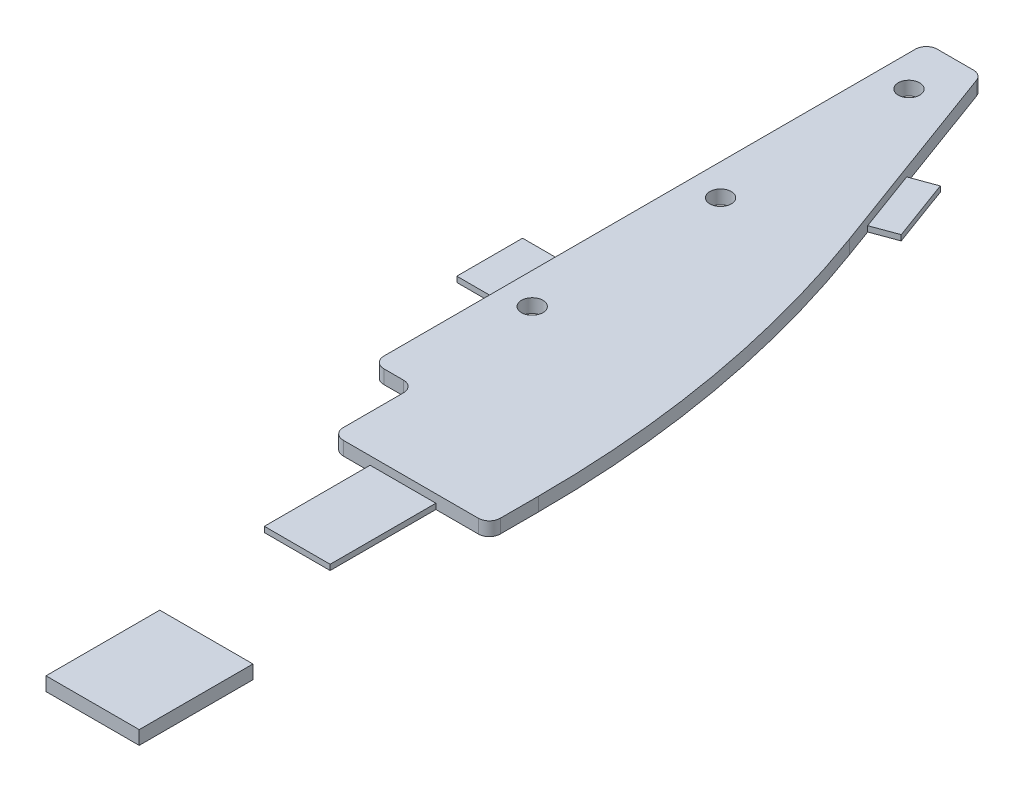
ISO-10303-21;
HEADER;
FILE_DESCRIPTION(('STEP AP214'),'2;1');
FILE_NAME('part.step','',(''),(''),'','','');
FILE_SCHEMA(('AUTOMOTIVE_DESIGN { 1 0 10303 214 1 1 1 1 }'));
ENDSEC;
DATA;
#1=APPLICATION_CONTEXT('core data for automotive mechanical design processes');
#2=APPLICATION_PROTOCOL_DEFINITION('international standard','automotive_design',2000,#1);
#3=PRODUCT_CONTEXT('',#1,'mechanical');
#4=PRODUCT('Part','Part','',(#3));
#5=PRODUCT_RELATED_PRODUCT_CATEGORY('part','',(#4));
#6=PRODUCT_DEFINITION_FORMATION('','',#4);
#7=PRODUCT_DEFINITION_CONTEXT('part definition',#1,'design');
#8=PRODUCT_DEFINITION('design','',#6,#7);
#9=PRODUCT_DEFINITION_SHAPE('','',#8);
#10=(LENGTH_UNIT() NAMED_UNIT(*) SI_UNIT(.MILLI.,.METRE.));
#11=(NAMED_UNIT(*) PLANE_ANGLE_UNIT() SI_UNIT($,.RADIAN.));
#12=(NAMED_UNIT(*) SI_UNIT($,.STERADIAN.) SOLID_ANGLE_UNIT());
#13=UNCERTAINTY_MEASURE_WITH_UNIT(LENGTH_MEASURE(1.E-05),#10,'distance_accuracy_value','');
#14=(GEOMETRIC_REPRESENTATION_CONTEXT(3) GLOBAL_UNCERTAINTY_ASSIGNED_CONTEXT((#13)) GLOBAL_UNIT_ASSIGNED_CONTEXT((#10,
#11,#12)) REPRESENTATION_CONTEXT('',''));
#15=CARTESIAN_POINT('',(0.,0.,0.));
#16=DIRECTION('',(0.,0.,1.));
#17=DIRECTION('',(1.,0.,0.));
#18=AXIS2_PLACEMENT_3D('',#15,#16,#17);
#19=CARTESIAN_POINT('',(-166.099808789646,-37.2537864150574,55.3629159312266));
#20=DIRECTION('',(1.,0.,0.));
#21=DIRECTION('',(0.,0.,-1.));
#22=AXIS2_PLACEMENT_3D('',#19,#20,#21);
#23=PLANE('',#22);
#24=DIRECTION('',(0.,0.,1.));
#25=VECTOR('',#24,1.);
#26=CARTESIAN_POINT('',(-166.099808789646,-3.175,55.3629159312266));
#27=LINE('',#26,#25);
#28=CARTESIAN_POINT('',(-166.099808789646,-3.175,55.3629159312266));
#29=VERTEX_POINT('',#28);
#30=CARTESIAN_POINT('',(-166.099808789646,-3.175,81.7207432362466));
#31=VERTEX_POINT('',#30);
#32=EDGE_CURVE('E60',#29,#31,#27,.T.);
#33=ORIENTED_EDGE('',*,*,#32,.F.);
#34=DIRECTION('',(0.,1.,0.));
#35=VECTOR('',#34,1.);
#36=CARTESIAN_POINT('',(-166.099808789646,-37.2537864150574,55.3629159312266));
#37=LINE('',#36,#35);
#38=CARTESIAN_POINT('',(-166.099808789646,0.,55.3629159312266));
#39=VERTEX_POINT('',#38);
#40=EDGE_CURVE('E88',#29,#39,#37,.T.);
#41=ORIENTED_EDGE('',*,*,#40,.T.);
#42=DIRECTION('',(0.,0.,-1.));
#43=VECTOR('',#42,1.);
#44=CARTESIAN_POINT('',(-166.099808789646,0.,55.3629159312266));
#45=LINE('',#44,#43);
#46=CARTESIAN_POINT('',(-166.099808789646,0.,81.7207432362466));
#47=VERTEX_POINT('',#46);
#48=EDGE_CURVE('E92',#47,#39,#45,.T.);
#49=ORIENTED_EDGE('',*,*,#48,.F.);
#50=DIRECTION('',(0.,1.,0.));
#51=VECTOR('',#50,1.);
#52=CARTESIAN_POINT('',(-166.099808789646,-37.2537864150574,81.7207432362466));
#53=LINE('',#52,#51);
#54=EDGE_CURVE('E115',#31,#47,#53,.T.);
#55=ORIENTED_EDGE('',*,*,#54,.F.);
#56=EDGE_LOOP('',(#33,#41,#49,#55));
#57=FACE_BOUND('',#56,.T.);
#58=ADVANCED_FACE('F52',(#57),#23,.T.);
#59=CARTESIAN_POINT('',(-166.099808789646,-37.2537864150574,81.7207432362466));
#60=DIRECTION('',(0.,0.,1.));
#61=DIRECTION('',(1.,0.,0.));
#62=AXIS2_PLACEMENT_3D('',#59,#60,#61);
#63=PLANE('',#62);
#64=DIRECTION('',(-1.,0.,0.));
#65=VECTOR('',#64,1.);
#66=CARTESIAN_POINT('',(-166.099808789646,-3.175,81.7207432362466));
#67=LINE('',#66,#65);
#68=CARTESIAN_POINT('',(-187.701397233134,-3.175,81.7207432362466));
#69=VERTEX_POINT('',#68);
#70=EDGE_CURVE('E66',#31,#69,#67,.T.);
#71=ORIENTED_EDGE('',*,*,#70,.F.);
#72=ORIENTED_EDGE('',*,*,#54,.T.);
#73=DIRECTION('',(1.,0.,0.));
#74=VECTOR('',#73,1.);
#75=CARTESIAN_POINT('',(-166.099808789646,0.,81.7207432362466));
#76=LINE('',#75,#74);
#77=CARTESIAN_POINT('',(-187.701397233134,0.,81.7207432362466));
#78=VERTEX_POINT('',#77);
#79=EDGE_CURVE('E97',#78,#47,#76,.T.);
#80=ORIENTED_EDGE('',*,*,#79,.F.);
#81=DIRECTION('',(0.,1.,0.));
#82=VECTOR('',#81,1.);
#83=CARTESIAN_POINT('',(-187.701397233134,-37.2537864150574,81.7207432362466));
#84=LINE('',#83,#82);
#85=EDGE_CURVE('E118',#69,#78,#84,.T.);
#86=ORIENTED_EDGE('',*,*,#85,.F.);
#87=EDGE_LOOP('',(#71,#72,#80,#86));
#88=FACE_BOUND('',#87,.T.);
#89=ADVANCED_FACE('F124',(#88),#63,.T.);
#90=CARTESIAN_POINT('',(-187.701397233134,-37.2537864150574,55.3629159312266));
#91=DIRECTION('',(-1.,0.,0.));
#92=DIRECTION('',(0.,0.,1.));
#93=AXIS2_PLACEMENT_3D('',#90,#91,#92);
#94=PLANE('',#93);
#95=DIRECTION('',(0.,0.,-1.));
#96=VECTOR('',#95,1.);
#97=CARTESIAN_POINT('',(-187.701397233134,-3.175,55.3629159312266));
#98=LINE('',#97,#96);
#99=CARTESIAN_POINT('',(-187.701397233134,-3.175,55.3629159312266));
#100=VERTEX_POINT('',#99);
#101=EDGE_CURVE('E117',#69,#100,#98,.T.);
#102=ORIENTED_EDGE('',*,*,#101,.F.);
#103=ORIENTED_EDGE('',*,*,#85,.T.);
#104=DIRECTION('',(0.,0.,1.));
#105=VECTOR('',#104,1.);
#106=CARTESIAN_POINT('',(-187.701397233134,0.,55.3629159312266));
#107=LINE('',#106,#105);
#108=CARTESIAN_POINT('',(-187.701397233134,0.,55.3629159312266));
#109=VERTEX_POINT('',#108);
#110=EDGE_CURVE('E105',#109,#78,#107,.T.);
#111=ORIENTED_EDGE('',*,*,#110,.F.);
#112=DIRECTION('',(0.,1.,0.));
#113=VECTOR('',#112,1.);
#114=CARTESIAN_POINT('',(-187.701397233134,-37.2537864150574,55.3629159312266));
#115=LINE('',#114,#113);
#116=EDGE_CURVE('E96',#100,#109,#115,.T.);
#117=ORIENTED_EDGE('',*,*,#116,.F.);
#118=EDGE_LOOP('',(#102,#103,#111,#117));
#119=FACE_BOUND('',#118,.T.);
#120=ADVANCED_FACE('F122',(#119),#94,.T.);
#121=CARTESIAN_POINT('',(-166.099808789646,-37.2537864150574,55.3629159312266));
#122=DIRECTION('',(0.,0.,-1.));
#123=DIRECTION('',(-1.,0.,0.));
#124=AXIS2_PLACEMENT_3D('',#121,#122,#123);
#125=PLANE('',#124);
#126=DIRECTION('',(1.,0.,0.));
#127=VECTOR('',#126,1.);
#128=CARTESIAN_POINT('',(-166.099808789646,-3.175,55.3629159312266));
#129=LINE('',#128,#127);
#130=EDGE_CURVE('E12',#100,#29,#129,.T.);
#131=ORIENTED_EDGE('',*,*,#130,.F.);
#132=ORIENTED_EDGE('',*,*,#116,.T.);
#133=DIRECTION('',(-1.,0.,0.));
#134=VECTOR('',#133,1.);
#135=CARTESIAN_POINT('',(-166.099808789646,0.,55.3629159312266));
#136=LINE('',#135,#134);
#137=EDGE_CURVE('E99',#39,#109,#136,.T.);
#138=ORIENTED_EDGE('',*,*,#137,.F.);
#139=ORIENTED_EDGE('',*,*,#40,.F.);
#140=EDGE_LOOP('',(#131,#132,#138,#139));
#141=FACE_BOUND('',#140,.T.);
#142=ADVANCED_FACE('F100',(#141),#125,.T.);
#143=CARTESIAN_POINT('',(0.,0.,0.));
#144=DIRECTION('',(0.,-1.,0.));
#145=DIRECTION('',(0.,0.,-1.));
#146=AXIS2_PLACEMENT_3D('',#143,#144,#145);
#147=PLANE('',#146);
#148=ORIENTED_EDGE('',*,*,#48,.T.);
#149=ORIENTED_EDGE('',*,*,#137,.T.);
#150=ORIENTED_EDGE('',*,*,#110,.T.);
#151=ORIENTED_EDGE('',*,*,#79,.T.);
#152=EDGE_LOOP('',(#148,#149,#150,#151));
#153=FACE_BOUND('',#152,.T.);
#154=ADVANCED_FACE('F107',(#153),#147,.F.);
#155=CARTESIAN_POINT('',(-420.6875,-3.175,-11.43));
#156=DIRECTION('',(0.,1.,0.));
#157=DIRECTION('',(0.,0.,1.));
#158=AXIS2_PLACEMENT_3D('',#155,#156,#157);
#159=PLANE('',#158);
#160=ORIENTED_EDGE('',*,*,#32,.T.);
#161=ORIENTED_EDGE('',*,*,#70,.T.);
#162=ORIENTED_EDGE('',*,*,#101,.T.);
#163=ORIENTED_EDGE('',*,*,#130,.T.);
#164=EDGE_LOOP('',(#160,#161,#162,#163));
#165=FACE_BOUND('',#164,.T.);
#166=ADVANCED_FACE('F126',(#165),#159,.F.);
#167=CLOSED_SHELL('',(#58,#89,#120,#142,#154,#166));
#168=MANIFOLD_SOLID_BREP('B2',#167);
#169=CARTESIAN_POINT('',(-166.6875,-3.175,0.));
#170=DIRECTION('',(1.,0.,0.));
#171=DIRECTION('',(0.,0.,-1.));
#172=AXIS2_PLACEMENT_3D('',#169,#170,#171);
#173=PLANE('',#172);
#174=DIRECTION('',(0.,0.,-1.));
#175=VECTOR('',#174,1.);
#176=CARTESIAN_POINT('',(-166.6875,0.,0.));
#177=LINE('',#176,#175);
#178=CARTESIAN_POINT('',(-166.6875,0.,-2.53999999999999));
#179=VERTEX_POINT('',#178);
#180=CARTESIAN_POINT('',(-166.6875,0.,-11.43));
#181=VERTEX_POINT('',#180);
#182=EDGE_CURVE('E447',#179,#181,#177,.T.);
#183=ORIENTED_EDGE('',*,*,#182,.F.);
#184=DIRECTION('',(0.,1.,0.));
#185=VECTOR('',#184,1.);
#186=CARTESIAN_POINT('',(-166.6875,-3.175,-2.53999999999999));
#187=LINE('',#186,#185);
#188=CARTESIAN_POINT('',(-166.6875,-3.175,-2.53999999999999));
#189=VERTEX_POINT('',#188);
#190=EDGE_CURVE('E577',#179,#189,#187,.F.);
#191=ORIENTED_EDGE('',*,*,#190,.T.);
#192=DIRECTION('',(0.,0.,-1.));
#193=VECTOR('',#192,1.);
#194=CARTESIAN_POINT('',(-166.6875,-3.175,0.));
#195=LINE('',#194,#193);
#196=CARTESIAN_POINT('',(-166.6875,-3.175,-11.43));
#197=VERTEX_POINT('',#196);
#198=EDGE_CURVE('E473',#189,#197,#195,.T.);
#199=ORIENTED_EDGE('',*,*,#198,.T.);
#200=DIRECTION('',(0.,1.,0.));
#201=VECTOR('',#200,1.);
#202=CARTESIAN_POINT('',(-166.6875,-3.175,-11.43));
#203=LINE('',#202,#201);
#204=EDGE_CURVE('E497',#197,#181,#203,.T.);
#205=ORIENTED_EDGE('',*,*,#204,.T.);
#206=EDGE_LOOP('',(#183,#191,#199,#205));
#207=FACE_BOUND('',#206,.T.);
#208=ADVANCED_FACE('F178',(#207),#173,.T.);
#209=CARTESIAN_POINT('',(-203.073,-3.175,0.));
#210=DIRECTION('',(0.,0.,1.));
#211=DIRECTION('',(1.,0.,0.));
#212=AXIS2_PLACEMENT_3D('',#209,#210,#211);
#213=PLANE('',#212);
#214=DIRECTION('',(0.,-1.,0.));
#215=VECTOR('',#214,1.);
#216=CARTESIAN_POINT('',(-194.307788789217,-1.905,0.));
#217=LINE('',#216,#215);
#218=CARTESIAN_POINT('',(-194.307788789217,-1.905,0.));
#219=VERTEX_POINT('',#218);
#220=CARTESIAN_POINT('',(-194.307788789217,-3.175,0.));
#221=VERTEX_POINT('',#220);
#222=EDGE_CURVE('E426',#219,#221,#217,.T.);
#223=ORIENTED_EDGE('',*,*,#222,.F.);
#224=DIRECTION('',(1.,0.,0.));
#225=VECTOR('',#224,1.);
#226=CARTESIAN_POINT('',(-194.307788789217,-1.905,0.));
#227=LINE('',#226,#225);
#228=CARTESIAN_POINT('',(-179.067788789217,-1.905,0.));
#229=VERTEX_POINT('',#228);
#230=EDGE_CURVE('E417',#219,#229,#227,.T.);
#231=ORIENTED_EDGE('',*,*,#230,.T.);
#232=DIRECTION('',(0.,-1.,0.));
#233=VECTOR('',#232,1.);
#234=CARTESIAN_POINT('',(-179.067788789217,-1.905,0.));
#235=LINE('',#234,#233);
#236=CARTESIAN_POINT('',(-179.067788789217,-3.175,0.));
#237=VERTEX_POINT('',#236);
#238=EDGE_CURVE('E439',#229,#237,#235,.T.);
#239=ORIENTED_EDGE('',*,*,#238,.T.);
#240=DIRECTION('',(1.,0.,0.));
#241=VECTOR('',#240,1.);
#242=CARTESIAN_POINT('',(-203.073,-3.175,0.));
#243=LINE('',#242,#241);
#244=CARTESIAN_POINT('',(-169.2275,-3.175,0.));
#245=VERTEX_POINT('',#244);
#246=EDGE_CURVE('E494',#237,#245,#243,.T.);
#247=ORIENTED_EDGE('',*,*,#246,.T.);
#248=DIRECTION('',(0.,1.,0.));
#249=VECTOR('',#248,1.);
#250=CARTESIAN_POINT('',(-169.2275,-3.175,0.));
#251=LINE('',#250,#249);
#252=CARTESIAN_POINT('',(-169.2275,0.,0.));
#253=VERTEX_POINT('',#252);
#254=EDGE_CURVE('E571',#245,#253,#251,.T.);
#255=ORIENTED_EDGE('',*,*,#254,.T.);
#256=DIRECTION('',(1.,0.,0.));
#257=VECTOR('',#256,1.);
#258=CARTESIAN_POINT('',(-203.073,0.,0.));
#259=LINE('',#258,#257);
#260=CARTESIAN_POINT('',(-200.533,0.,0.));
#261=VERTEX_POINT('',#260);
#262=EDGE_CURVE('E476',#261,#253,#259,.T.);
#263=ORIENTED_EDGE('',*,*,#262,.F.);
#264=DIRECTION('',(0.,1.,0.));
#265=VECTOR('',#264,1.);
#266=CARTESIAN_POINT('',(-200.533,-3.175,0.));
#267=LINE('',#266,#265);
#268=CARTESIAN_POINT('',(-200.533,-3.175,0.));
#269=VERTEX_POINT('',#268);
#270=EDGE_CURVE('E568',#261,#269,#267,.F.);
#271=ORIENTED_EDGE('',*,*,#270,.T.);
#272=EDGE_CURVE('E495',#269,#221,#243,.T.);
#273=ORIENTED_EDGE('',*,*,#272,.T.);
#274=EDGE_LOOP('',(#223,#231,#239,#247,#255,#263,#271,#273));
#275=FACE_BOUND('',#274,.T.);
#276=ADVANCED_FACE('F567',(#275),#213,.T.);
#277=CARTESIAN_POINT('',(-203.073,-3.175,-19.05));
#278=DIRECTION('',(-1.,0.,0.));
#279=DIRECTION('',(0.,0.,1.));
#280=AXIS2_PLACEMENT_3D('',#277,#278,#279);
#281=PLANE('',#280);
#282=DIRECTION('',(0.,0.,1.));
#283=VECTOR('',#282,1.);
#284=CARTESIAN_POINT('',(-203.073,-3.175,-19.05));
#285=LINE('',#284,#283);
#286=CARTESIAN_POINT('',(-203.073,-3.175,-16.51));
#287=VERTEX_POINT('',#286);
#288=CARTESIAN_POINT('',(-203.073,-3.175,-2.54000000000001));
#289=VERTEX_POINT('',#288);
#290=EDGE_CURVE('E491',#287,#289,#285,.T.);
#291=ORIENTED_EDGE('',*,*,#290,.T.);
#292=DIRECTION('',(0.,1.,0.));
#293=VECTOR('',#292,1.);
#294=CARTESIAN_POINT('',(-203.073,-3.175,-2.54));
#295=LINE('',#294,#293);
#296=CARTESIAN_POINT('',(-203.073,0.,-2.54000000000001));
#297=VERTEX_POINT('',#296);
#298=EDGE_CURVE('E586',#289,#297,#295,.T.);
#299=ORIENTED_EDGE('',*,*,#298,.T.);
#300=DIRECTION('',(0.,0.,1.));
#301=VECTOR('',#300,1.);
#302=CARTESIAN_POINT('',(-203.073,0.,-19.05));
#303=LINE('',#302,#301);
#304=CARTESIAN_POINT('',(-203.073,0.,-16.51));
#305=VERTEX_POINT('',#304);
#306=EDGE_CURVE('E535',#305,#297,#303,.T.);
#307=ORIENTED_EDGE('',*,*,#306,.F.);
#308=DIRECTION('',(0.,1.,0.));
#309=VECTOR('',#308,1.);
#310=CARTESIAN_POINT('',(-203.073,-3.175,-16.51));
#311=LINE('',#310,#309);
#312=EDGE_CURVE('E584',#305,#287,#311,.F.);
#313=ORIENTED_EDGE('',*,*,#312,.T.);
#314=EDGE_LOOP('',(#291,#299,#307,#313));
#315=FACE_BOUND('',#314,.T.);
#316=ADVANCED_FACE('F594',(#315),#281,.T.);
#317=CARTESIAN_POINT('',(-212.725,-3.175,-19.05));
#318=DIRECTION('',(0.,0.,1.));
#319=DIRECTION('',(1.,0.,0.));
#320=AXIS2_PLACEMENT_3D('',#317,#318,#319);
#321=PLANE('',#320);
#322=DIRECTION('',(1.,0.,0.));
#323=VECTOR('',#322,1.);
#324=CARTESIAN_POINT('',(-212.725,0.,-19.05));
#325=LINE('',#324,#323);
#326=CARTESIAN_POINT('',(-210.185,0.,-19.05));
#327=VERTEX_POINT('',#326);
#328=CARTESIAN_POINT('',(-205.613,0.,-19.05));
#329=VERTEX_POINT('',#328);
#330=EDGE_CURVE('E531',#327,#329,#325,.T.);
#331=ORIENTED_EDGE('',*,*,#330,.F.);
#332=DIRECTION('',(0.,1.,0.));
#333=VECTOR('',#332,1.);
#334=CARTESIAN_POINT('',(-210.185,-3.175,-19.05));
#335=LINE('',#334,#333);
#336=CARTESIAN_POINT('',(-210.185,-3.175,-19.05));
#337=VERTEX_POINT('',#336);
#338=EDGE_CURVE('E575',#327,#337,#335,.F.);
#339=ORIENTED_EDGE('',*,*,#338,.T.);
#340=DIRECTION('',(1.,0.,0.));
#341=VECTOR('',#340,1.);
#342=CARTESIAN_POINT('',(-212.725,-3.175,-19.05));
#343=LINE('',#342,#341);
#344=CARTESIAN_POINT('',(-205.613,-3.175,-19.05));
#345=VERTEX_POINT('',#344);
#346=EDGE_CURVE('E488',#337,#345,#343,.T.);
#347=ORIENTED_EDGE('',*,*,#346,.T.);
#348=DIRECTION('',(0.,1.,0.));
#349=VECTOR('',#348,1.);
#350=CARTESIAN_POINT('',(-205.613,0.,-19.05));
#351=LINE('',#350,#349);
#352=EDGE_CURVE('E579',#345,#329,#351,.T.);
#353=ORIENTED_EDGE('',*,*,#352,.T.);
#354=EDGE_LOOP('',(#331,#339,#347,#353));
#355=FACE_BOUND('',#354,.T.);
#356=ADVANCED_FACE('F605',(#355),#321,.T.);
#357=CARTESIAN_POINT('',(-212.725,-3.175,-147.32));
#358=DIRECTION('',(-1.,0.,0.));
#359=DIRECTION('',(0.,0.,1.));
#360=AXIS2_PLACEMENT_3D('',#357,#358,#359);
#361=PLANE('',#360);
#362=DIRECTION('',(0.,-1.,0.));
#363=VECTOR('',#362,1.);
#364=CARTESIAN_POINT('',(-212.725,-1.90499999999978,-63.2334417408771));
#365=LINE('',#364,#363);
#366=CARTESIAN_POINT('',(-212.725,-1.90499999999978,-63.2334417408771));
#367=VERTEX_POINT('',#366);
#368=CARTESIAN_POINT('',(-212.725,-3.175,-63.2334417408771));
#369=VERTEX_POINT('',#368);
#370=EDGE_CURVE('E396',#367,#369,#365,.T.);
#371=ORIENTED_EDGE('',*,*,#370,.F.);
#372=DIRECTION('',(0.,0.,1.));
#373=VECTOR('',#372,1.);
#374=CARTESIAN_POINT('',(-212.725,-1.90499999999978,-63.2334417408771));
#375=LINE('',#374,#373);
#376=CARTESIAN_POINT('',(-212.725,-1.90499999999983,-47.9934417408771));
#377=VERTEX_POINT('',#376);
#378=EDGE_CURVE('E387',#367,#377,#375,.T.);
#379=ORIENTED_EDGE('',*,*,#378,.T.);
#380=DIRECTION('',(0.,-1.,0.));
#381=VECTOR('',#380,1.);
#382=CARTESIAN_POINT('',(-212.725,-1.90499999999983,-47.9934417408771));
#383=LINE('',#382,#381);
#384=CARTESIAN_POINT('',(-212.725,-3.17499999999983,-47.9934417408771));
#385=VERTEX_POINT('',#384);
#386=EDGE_CURVE('E409',#377,#385,#383,.T.);
#387=ORIENTED_EDGE('',*,*,#386,.T.);
#388=DIRECTION('',(0.,0.,1.));
#389=VECTOR('',#388,1.);
#390=CARTESIAN_POINT('',(-212.725,-3.175,-147.32));
#391=LINE('',#390,#389);
#392=CARTESIAN_POINT('',(-212.725,-3.175,-21.59));
#393=VERTEX_POINT('',#392);
#394=EDGE_CURVE('E485',#385,#393,#391,.T.);
#395=ORIENTED_EDGE('',*,*,#394,.T.);
#396=DIRECTION('',(0.,1.,0.));
#397=VECTOR('',#396,1.);
#398=CARTESIAN_POINT('',(-212.725,-3.175,-21.59));
#399=LINE('',#398,#397);
#400=CARTESIAN_POINT('',(-212.725,0.,-21.59));
#401=VERTEX_POINT('',#400);
#402=EDGE_CURVE('E612',#393,#401,#399,.T.);
#403=ORIENTED_EDGE('',*,*,#402,.T.);
#404=DIRECTION('',(0.,0.,1.));
#405=VECTOR('',#404,1.);
#406=CARTESIAN_POINT('',(-212.725,0.,-147.32));
#407=LINE('',#406,#405);
#408=CARTESIAN_POINT('',(-212.725,0.,-144.78));
#409=VERTEX_POINT('',#408);
#410=EDGE_CURVE('E536',#409,#401,#407,.T.);
#411=ORIENTED_EDGE('',*,*,#410,.F.);
#412=DIRECTION('',(0.,1.,0.));
#413=VECTOR('',#412,1.);
#414=CARTESIAN_POINT('',(-212.725,-3.175,-144.78));
#415=LINE('',#414,#413);
#416=CARTESIAN_POINT('',(-212.725,-3.175,-144.78));
#417=VERTEX_POINT('',#416);
#418=EDGE_CURVE('E646',#409,#417,#415,.F.);
#419=ORIENTED_EDGE('',*,*,#418,.T.);
#420=EDGE_CURVE('E486',#417,#369,#391,.T.);
#421=ORIENTED_EDGE('',*,*,#420,.T.);
#422=EDGE_LOOP('',(#371,#379,#387,#395,#403,#411,#419,#421));
#423=FACE_BOUND('',#422,.T.);
#424=ADVANCED_FACE('F737',(#423),#361,.T.);
#425=CARTESIAN_POINT('',(-200.025,-3.175,-147.32));
#426=DIRECTION('',(0.,0.,-1.));
#427=DIRECTION('',(-1.,0.,0.));
#428=AXIS2_PLACEMENT_3D('',#425,#426,#427);
#429=PLANE('',#428);
#430=DIRECTION('',(-1.,0.,0.));
#431=VECTOR('',#430,1.);
#432=CARTESIAN_POINT('',(-200.025,-3.175,-147.32));
#433=LINE('',#432,#431);
#434=CARTESIAN_POINT('',(-201.797398636597,-3.175,-147.32));
#435=VERTEX_POINT('',#434);
#436=CARTESIAN_POINT('',(-210.185,-3.175,-147.32));
#437=VERTEX_POINT('',#436);
#438=EDGE_CURVE('E482',#435,#437,#433,.T.);
#439=ORIENTED_EDGE('',*,*,#438,.T.);
#440=DIRECTION('',(0.,1.,0.));
#441=VECTOR('',#440,1.);
#442=CARTESIAN_POINT('',(-210.185,-3.175,-147.32));
#443=LINE('',#442,#441);
#444=CARTESIAN_POINT('',(-210.185,0.,-147.32));
#445=VERTEX_POINT('',#444);
#446=EDGE_CURVE('E551',#437,#445,#443,.T.);
#447=ORIENTED_EDGE('',*,*,#446,.T.);
#448=DIRECTION('',(-1.,0.,0.));
#449=VECTOR('',#448,1.);
#450=CARTESIAN_POINT('',(-200.025,0.,-147.32));
#451=LINE('',#450,#449);
#452=CARTESIAN_POINT('',(-201.797398636597,0.,-147.32));
#453=VERTEX_POINT('',#452);
#454=EDGE_CURVE('E636',#453,#445,#451,.T.);
#455=ORIENTED_EDGE('',*,*,#454,.F.);
#456=DIRECTION('',(0.,1.,0.));
#457=VECTOR('',#456,1.);
#458=CARTESIAN_POINT('',(-201.797398636597,-3.175,-147.32));
#459=LINE('',#458,#457);
#460=EDGE_CURVE('E548',#453,#435,#459,.F.);
#461=ORIENTED_EDGE('',*,*,#460,.T.);
#462=EDGE_LOOP('',(#439,#447,#455,#461));
#463=FACE_BOUND('',#462,.T.);
#464=ADVANCED_FACE('F740',(#463),#429,.T.);
#465=CARTESIAN_POINT('',(-182.288444295682,-3.175,-99.0763931904174));
#466=DIRECTION('',(0.938578959465821,0.,-0.345064540119752));
#467=DIRECTION('',(-0.345064540119753,0.,-0.938578959465821));
#468=AXIS2_PLACEMENT_3D('',#465,#466,#467);
#469=PLANE('',#468);
#470=DIRECTION('',(0.,-1.,0.));
#471=VECTOR('',#470,1.);
#472=CARTESIAN_POINT('',(-184.736614771287,-1.90499999999963,-105.735441079811));
#473=LINE('',#472,#471);
#474=CARTESIAN_POINT('',(-184.736614771287,-1.90499999999963,-105.735441079811));
#475=VERTEX_POINT('',#474);
#476=CARTESIAN_POINT('',(-184.736614771287,-3.175,-105.735441079811));
#477=VERTEX_POINT('',#476);
#478=EDGE_CURVE('E193',#475,#477,#473,.T.);
#479=ORIENTED_EDGE('',*,*,#478,.F.);
#480=DIRECTION('',(-0.345064540119752,0.,-0.938578959465822));
#481=VECTOR('',#480,1.);
#482=CARTESIAN_POINT('',(-184.736614771287,-1.90499999999963,-105.735441079811));
#483=LINE('',#482,#481);
#484=CARTESIAN_POINT('',(-189.995398362712,-1.90499999999958,-120.03938442207));
#485=VERTEX_POINT('',#484);
#486=EDGE_CURVE('E197',#475,#485,#483,.T.);
#487=ORIENTED_EDGE('',*,*,#486,.T.);
#488=DIRECTION('',(0.,-1.,0.));
#489=VECTOR('',#488,1.);
#490=CARTESIAN_POINT('',(-189.995398362712,-1.90499999999958,-120.03938442207));
#491=LINE('',#490,#489);
#492=CARTESIAN_POINT('',(-189.995398362712,-3.17499999999958,-120.03938442207));
#493=VERTEX_POINT('',#492);
#494=EDGE_CURVE('E360',#485,#493,#491,.T.);
#495=ORIENTED_EDGE('',*,*,#494,.T.);
#496=DIRECTION('',(-0.345064540119753,0.,-0.938578959465821));
#497=VECTOR('',#496,1.);
#498=CARTESIAN_POINT('',(-182.288444295682,-3.175,-99.0763931904174));
#499=LINE('',#498,#497);
#500=CARTESIAN_POINT('',(-199.413408079554,-3.175,-145.656463931904));
#501=VERTEX_POINT('',#500);
#502=EDGE_CURVE('E479',#493,#501,#499,.T.);
#503=ORIENTED_EDGE('',*,*,#502,.T.);
#504=DIRECTION('',(0.,1.,0.));
#505=VECTOR('',#504,1.);
#506=CARTESIAN_POINT('',(-199.413408079554,-3.175,-145.656463931904));
#507=LINE('',#506,#505);
#508=CARTESIAN_POINT('',(-199.413408079554,0.,-145.656463931904));
#509=VERTEX_POINT('',#508);
#510=EDGE_CURVE('E624',#501,#509,#507,.T.);
#511=ORIENTED_EDGE('',*,*,#510,.T.);
#512=DIRECTION('',(-0.345064540119753,0.,-0.938578959465821));
#513=VECTOR('',#512,1.);
#514=CARTESIAN_POINT('',(-182.288444295682,0.,-99.0763931904174));
#515=LINE('',#514,#513);
#516=CARTESIAN_POINT('',(-182.288444295682,0.,-99.0763931904174));
#517=VERTEX_POINT('',#516);
#518=EDGE_CURVE('E630',#517,#509,#515,.T.);
#519=ORIENTED_EDGE('',*,*,#518,.F.);
#520=DIRECTION('',(0.,1.,0.));
#521=VECTOR('',#520,1.);
#522=CARTESIAN_POINT('',(-182.288444295682,-3.175,-99.0763931904174));
#523=LINE('',#522,#521);
#524=CARTESIAN_POINT('',(-182.288444295682,-3.175,-99.0763931904174));
#525=VERTEX_POINT('',#524);
#526=EDGE_CURVE('E546',#525,#517,#523,.T.);
#527=ORIENTED_EDGE('',*,*,#526,.F.);
#528=EDGE_CURVE('E480',#525,#477,#499,.T.);
#529=ORIENTED_EDGE('',*,*,#528,.T.);
#530=EDGE_LOOP('',(#479,#487,#495,#503,#511,#519,#527,#529));
#531=FACE_BOUND('',#530,.T.);
#532=ADVANCED_FACE('F629',(#531),#469,.T.);
#533=CARTESIAN_POINT('',(-420.6875,-3.175,-11.43));
#534=DIRECTION('',(0.,1.,0.));
#535=DIRECTION('',(0.,0.,1.));
#536=AXIS2_PLACEMENT_3D('',#533,#534,#535);
#537=CYLINDRICAL_SURFACE('',#536,254.);
#538=CARTESIAN_POINT('',(-420.6875,0.,-11.43));
#539=DIRECTION('',(0.,1.,0.));
#540=DIRECTION('',(0.,0.,1.));
#541=AXIS2_PLACEMENT_3D('',#538,#539,#540);
#542=CIRCLE('',#541,254.);
#543=EDGE_CURVE('E501',#181,#517,#542,.T.);
#544=ORIENTED_EDGE('',*,*,#543,.F.);
#545=ORIENTED_EDGE('',*,*,#204,.F.);
#546=CARTESIAN_POINT('',(-420.6875,-3.175,-11.43));
#547=DIRECTION('',(0.,1.,0.));
#548=DIRECTION('',(0.,0.,1.));
#549=AXIS2_PLACEMENT_3D('',#546,#547,#548);
#550=CIRCLE('',#549,254.);
#551=EDGE_CURVE('E475',#197,#525,#550,.T.);
#552=ORIENTED_EDGE('',*,*,#551,.T.);
#553=ORIENTED_EDGE('',*,*,#526,.T.);
#554=EDGE_LOOP('',(#544,#545,#552,#553));
#555=FACE_BOUND('',#554,.T.);
#556=ADVANCED_FACE('F673',(#555),#537,.T.);
#557=CARTESIAN_POINT('',(-420.6875,-3.175,-11.43));
#558=DIRECTION('',(0.,1.,0.));
#559=DIRECTION('',(0.,0.,1.));
#560=AXIS2_PLACEMENT_3D('',#557,#558,#559);
#561=PLANE('',#560);
#562=CARTESIAN_POINT('',(-205.486,-3.175,-48.73625));
#563=DIRECTION('',(0.,1.,0.));
#564=DIRECTION('',(0.,0.,1.));
#565=AXIS2_PLACEMENT_3D('',#562,#563,#564);
#566=CIRCLE('',#565,2.4892);
#567=CARTESIAN_POINT('',(-205.486,-3.175,-46.24705));
#568=VERTEX_POINT('',#567);
#569=EDGE_CURVE('E444',#568,#568,#566,.T.);
#570=ORIENTED_EDGE('',*,*,#569,.T.);
#571=EDGE_LOOP('',(#570));
#572=FACE_BOUND('',#571,.T.);
#573=CARTESIAN_POINT('',(-205.486,-3.175,-92.3925));
#574=DIRECTION('',(0.,1.,0.));
#575=DIRECTION('',(0.,0.,1.));
#576=AXIS2_PLACEMENT_3D('',#573,#574,#575);
#577=CIRCLE('',#576,2.4892);
#578=CARTESIAN_POINT('',(-205.486,-3.175,-89.9033));
#579=VERTEX_POINT('',#578);
#580=EDGE_CURVE('E453',#579,#579,#577,.T.);
#581=ORIENTED_EDGE('',*,*,#580,.T.);
#582=EDGE_LOOP('',(#581));
#583=FACE_BOUND('',#582,.T.);
#584=CARTESIAN_POINT('',(-205.486,-3.175,-136.04875));
#585=DIRECTION('',(0.,1.,0.));
#586=DIRECTION('',(0.,0.,1.));
#587=AXIS2_PLACEMENT_3D('',#584,#585,#586);
#588=CIRCLE('',#587,2.48920000000001);
#589=CARTESIAN_POINT('',(-205.486,-3.175,-133.55955));
#590=VERTEX_POINT('',#589);
#591=EDGE_CURVE('E467',#590,#590,#588,.T.);
#592=ORIENTED_EDGE('',*,*,#591,.T.);
#593=EDGE_LOOP('',(#592));
#594=FACE_BOUND('',#593,.T.);
#595=ORIENTED_EDGE('',*,*,#420,.F.);
#596=CARTESIAN_POINT('',(-210.185,-3.175,-144.78));
#597=DIRECTION('',(0.,1.,0.));
#598=DIRECTION('',(0.,0.,1.));
#599=AXIS2_PLACEMENT_3D('',#596,#597,#598);
#600=CIRCLE('',#599,2.54);
#601=EDGE_CURVE('E617',#417,#437,#600,.F.);
#602=ORIENTED_EDGE('',*,*,#601,.T.);
#603=ORIENTED_EDGE('',*,*,#438,.F.);
#604=CARTESIAN_POINT('',(-201.797398636597,-3.175,-144.78));
#605=DIRECTION('',(0.,1.,0.));
#606=DIRECTION('',(0.,0.,1.));
#607=AXIS2_PLACEMENT_3D('',#604,#605,#606);
#608=CIRCLE('',#607,2.54);
#609=EDGE_CURVE('E613',#435,#501,#608,.F.);
#610=ORIENTED_EDGE('',*,*,#609,.T.);
#611=ORIENTED_EDGE('',*,*,#502,.F.);
#612=DIRECTION('',(0.938578959465821,0.,-0.345064540119754));
#613=VECTOR('',#612,1.);
#614=CARTESIAN_POINT('',(-189.995398362712,-3.17499999999958,-120.03938442207));
#615=LINE('',#614,#613);
#616=CARTESIAN_POINT('',(-184.304516726998,-3.17499999999957,-122.131612715384));
#617=VERTEX_POINT('',#616);
#618=EDGE_CURVE('E378',#493,#617,#615,.T.);
#619=ORIENTED_EDGE('',*,*,#618,.T.);
#620=DIRECTION('',(0.345064540119753,0.,0.938578959465821));
#621=VECTOR('',#620,1.);
#622=CARTESIAN_POINT('',(-179.045733135573,-3.17499999999962,-107.827669373125));
#623=LINE('',#622,#621);
#624=CARTESIAN_POINT('',(-179.045733135573,-3.17499999999962,-107.827669373125));
#625=VERTEX_POINT('',#624);
#626=EDGE_CURVE('E355',#617,#625,#623,.T.);
#627=ORIENTED_EDGE('',*,*,#626,.T.);
#628=DIRECTION('',(-0.938578959465821,0.,0.345064540119752));
#629=VECTOR('',#628,1.);
#630=CARTESIAN_POINT('',(-184.736614771287,-3.17499999999963,-105.735441079811));
#631=LINE('',#630,#629);
#632=EDGE_CURVE('E375',#625,#477,#631,.T.);
#633=ORIENTED_EDGE('',*,*,#632,.T.);
#634=ORIENTED_EDGE('',*,*,#528,.F.);
#635=ORIENTED_EDGE('',*,*,#551,.F.);
#636=ORIENTED_EDGE('',*,*,#198,.F.);
#637=CARTESIAN_POINT('',(-169.2275,-3.175,-2.54));
#638=DIRECTION('',(0.,1.,0.));
#639=DIRECTION('',(0.,0.,1.));
#640=AXIS2_PLACEMENT_3D('',#637,#638,#639);
#641=CIRCLE('',#640,2.54);
#642=EDGE_CURVE('E614',#189,#245,#641,.F.);
#643=ORIENTED_EDGE('',*,*,#642,.T.);
#644=ORIENTED_EDGE('',*,*,#246,.F.);
#645=DIRECTION('',(0.,0.,1.));
#646=VECTOR('',#645,1.);
#647=CARTESIAN_POINT('',(-179.067788789217,-3.175,0.));
#648=LINE('',#647,#646);
#649=CARTESIAN_POINT('',(-179.067788789217,-3.17500000000009,24.5069607169057));
#650=VERTEX_POINT('',#649);
#651=EDGE_CURVE('E429',#237,#650,#648,.T.);
#652=ORIENTED_EDGE('',*,*,#651,.T.);
#653=DIRECTION('',(-1.,0.,0.));
#654=VECTOR('',#653,1.);
#655=CARTESIAN_POINT('',(-194.307788789217,-3.17500000000009,24.5069607169057));
#656=LINE('',#655,#654);
#657=CARTESIAN_POINT('',(-194.307788789217,-3.17500000000009,24.5069607169057));
#658=VERTEX_POINT('',#657);
#659=EDGE_CURVE('E418',#650,#658,#656,.T.);
#660=ORIENTED_EDGE('',*,*,#659,.T.);
#661=DIRECTION('',(0.,0.,-1.));
#662=VECTOR('',#661,1.);
#663=CARTESIAN_POINT('',(-194.307788789217,-3.175,0.));
#664=LINE('',#663,#662);
#665=EDGE_CURVE('E406',#658,#221,#664,.T.);
#666=ORIENTED_EDGE('',*,*,#665,.T.);
#667=ORIENTED_EDGE('',*,*,#272,.F.);
#668=CARTESIAN_POINT('',(-200.533,-3.175,-2.54));
#669=DIRECTION('',(0.,1.,0.));
#670=DIRECTION('',(0.,0.,1.));
#671=AXIS2_PLACEMENT_3D('',#668,#669,#670);
#672=CIRCLE('',#671,2.54);
#673=EDGE_CURVE('E574',#269,#289,#672,.F.);
#674=ORIENTED_EDGE('',*,*,#673,.T.);
#675=ORIENTED_EDGE('',*,*,#290,.F.);
#676=CARTESIAN_POINT('',(-205.613,-3.175,-16.51));
#677=DIRECTION('',(0.,1.,0.));
#678=DIRECTION('',(0.,0.,1.));
#679=AXIS2_PLACEMENT_3D('',#676,#677,#678);
#680=CIRCLE('',#679,2.54);
#681=EDGE_CURVE('E50',#287,#345,#680,.T.);
#682=ORIENTED_EDGE('',*,*,#681,.T.);
#683=ORIENTED_EDGE('',*,*,#346,.F.);
#684=CARTESIAN_POINT('',(-210.185,-3.175,-21.59));
#685=DIRECTION('',(0.,1.,0.));
#686=DIRECTION('',(0.,0.,1.));
#687=AXIS2_PLACEMENT_3D('',#684,#685,#686);
#688=CIRCLE('',#687,2.54);
#689=EDGE_CURVE('E611',#337,#393,#688,.F.);
#690=ORIENTED_EDGE('',*,*,#689,.T.);
#691=ORIENTED_EDGE('',*,*,#394,.F.);
#692=DIRECTION('',(-1.,0.,0.));
#693=VECTOR('',#692,1.);
#694=CARTESIAN_POINT('',(-212.725,-3.17499999999983,-47.9934417408771));
#695=LINE('',#694,#693);
#696=CARTESIAN_POINT('',(-222.213699202541,-3.17499999999983,-47.9934417408771));
#697=VERTEX_POINT('',#696);
#698=EDGE_CURVE('E399',#385,#697,#695,.T.);
#699=ORIENTED_EDGE('',*,*,#698,.T.);
#700=DIRECTION('',(0.,0.,-1.));
#701=VECTOR('',#700,1.);
#702=CARTESIAN_POINT('',(-222.213699202541,-3.17499999999978,-63.2334417408771));
#703=LINE('',#702,#701);
#704=CARTESIAN_POINT('',(-222.213699202541,-3.17499999999978,-63.2334417408771));
#705=VERTEX_POINT('',#704);
#706=EDGE_CURVE('E388',#697,#705,#703,.T.);
#707=ORIENTED_EDGE('',*,*,#706,.T.);
#708=DIRECTION('',(1.,0.,0.));
#709=VECTOR('',#708,1.);
#710=CARTESIAN_POINT('',(-212.725,-3.17499999999978,-63.2334417408771));
#711=LINE('',#710,#709);
#712=EDGE_CURVE('E381',#705,#369,#711,.T.);
#713=ORIENTED_EDGE('',*,*,#712,.T.);
#714=EDGE_LOOP('',(#595,#602,#603,#610,#611,#619,#627,#633,#634,#635,#636,#643,#644,#652,#660,
#666,#667,#674,#675,#682,#683,#690,#691,#699,#707,#713));
#715=FACE_BOUND('',#714,.T.);
#716=ADVANCED_FACE('F601',(#572,#583,#594,#715),#561,.F.);
#717=CARTESIAN_POINT('',(-420.6875,0.,-11.43));
#718=DIRECTION('',(0.,1.,0.));
#719=DIRECTION('',(0.,0.,1.));
#720=AXIS2_PLACEMENT_3D('',#717,#718,#719);
#721=PLANE('',#720);
#722=CARTESIAN_POINT('',(-205.486,0.,-48.73625));
#723=DIRECTION('',(0.,1.,0.));
#724=DIRECTION('',(0.,0.,1.));
#725=AXIS2_PLACEMENT_3D('',#722,#723,#724);
#726=CIRCLE('',#725,2.4892);
#727=CARTESIAN_POINT('',(-205.486,0.,-46.24705));
#728=VERTEX_POINT('',#727);
#729=EDGE_CURVE('E448',#728,#728,#726,.T.);
#730=ORIENTED_EDGE('',*,*,#729,.F.);
#731=EDGE_LOOP('',(#730));
#732=FACE_BOUND('',#731,.T.);
#733=CARTESIAN_POINT('',(-205.486,0.,-92.3925));
#734=DIRECTION('',(0.,1.,0.));
#735=DIRECTION('',(0.,0.,1.));
#736=AXIS2_PLACEMENT_3D('',#733,#734,#735);
#737=CIRCLE('',#736,2.4892);
#738=CARTESIAN_POINT('',(-205.486,0.,-89.9033));
#739=VERTEX_POINT('',#738);
#740=EDGE_CURVE('E462',#739,#739,#737,.T.);
#741=ORIENTED_EDGE('',*,*,#740,.F.);
#742=EDGE_LOOP('',(#741));
#743=FACE_BOUND('',#742,.T.);
#744=CARTESIAN_POINT('',(-205.486,0.,-136.04875));
#745=DIRECTION('',(0.,1.,0.));
#746=DIRECTION('',(0.,0.,1.));
#747=AXIS2_PLACEMENT_3D('',#744,#745,#746);
#748=CIRCLE('',#747,2.48920000000001);
#749=CARTESIAN_POINT('',(-205.486,0.,-133.55955));
#750=VERTEX_POINT('',#749);
#751=EDGE_CURVE('E436',#750,#750,#748,.T.);
#752=ORIENTED_EDGE('',*,*,#751,.F.);
#753=EDGE_LOOP('',(#752));
#754=FACE_BOUND('',#753,.T.);
#755=ORIENTED_EDGE('',*,*,#454,.T.);
#756=CARTESIAN_POINT('',(-210.185,0.,-144.78));
#757=DIRECTION('',(0.,1.,0.));
#758=DIRECTION('',(0.,0.,1.));
#759=AXIS2_PLACEMENT_3D('',#756,#757,#758);
#760=CIRCLE('',#759,2.54);
#761=EDGE_CURVE('E641',#445,#409,#760,.T.);
#762=ORIENTED_EDGE('',*,*,#761,.T.);
#763=ORIENTED_EDGE('',*,*,#410,.T.);
#764=CARTESIAN_POINT('',(-210.185,0.,-21.59));
#765=DIRECTION('',(0.,1.,0.));
#766=DIRECTION('',(0.,0.,1.));
#767=AXIS2_PLACEMENT_3D('',#764,#765,#766);
#768=CIRCLE('',#767,2.54);
#769=EDGE_CURVE('E514',#401,#327,#768,.T.);
#770=ORIENTED_EDGE('',*,*,#769,.T.);
#771=ORIENTED_EDGE('',*,*,#330,.T.);
#772=CARTESIAN_POINT('',(-205.613,0.,-16.51));
#773=DIRECTION('',(0.,1.,0.));
#774=DIRECTION('',(0.,0.,1.));
#775=AXIS2_PLACEMENT_3D('',#772,#773,#774);
#776=CIRCLE('',#775,2.54);
#777=EDGE_CURVE('E186',#329,#305,#776,.F.);
#778=ORIENTED_EDGE('',*,*,#777,.T.);
#779=ORIENTED_EDGE('',*,*,#306,.T.);
#780=CARTESIAN_POINT('',(-200.533,0.,-2.54));
#781=DIRECTION('',(0.,1.,0.));
#782=DIRECTION('',(0.,0.,1.));
#783=AXIS2_PLACEMENT_3D('',#780,#781,#782);
#784=CIRCLE('',#783,2.54);
#785=EDGE_CURVE('E515',#297,#261,#784,.T.);
#786=ORIENTED_EDGE('',*,*,#785,.T.);
#787=ORIENTED_EDGE('',*,*,#262,.T.);
#788=CARTESIAN_POINT('',(-169.2275,0.,-2.54));
#789=DIRECTION('',(0.,1.,0.));
#790=DIRECTION('',(0.,0.,1.));
#791=AXIS2_PLACEMENT_3D('',#788,#789,#790);
#792=CIRCLE('',#791,2.54);
#793=EDGE_CURVE('E509',#253,#179,#792,.T.);
#794=ORIENTED_EDGE('',*,*,#793,.T.);
#795=ORIENTED_EDGE('',*,*,#182,.T.);
#796=ORIENTED_EDGE('',*,*,#543,.T.);
#797=ORIENTED_EDGE('',*,*,#518,.T.);
#798=CARTESIAN_POINT('',(-201.797398636597,0.,-144.78));
#799=DIRECTION('',(0.,1.,0.));
#800=DIRECTION('',(0.,0.,1.));
#801=AXIS2_PLACEMENT_3D('',#798,#799,#800);
#802=CIRCLE('',#801,2.54);
#803=EDGE_CURVE('E520',#509,#453,#802,.T.);
#804=ORIENTED_EDGE('',*,*,#803,.T.);
#805=EDGE_LOOP('',(#755,#762,#763,#770,#771,#778,#779,#786,#787,#794,#795,#796,#797,#804));
#806=FACE_BOUND('',#805,.T.);
#807=ADVANCED_FACE('F180',(#732,#743,#754,#806),#721,.T.);
#808=CARTESIAN_POINT('',(-210.185,-3.175,-144.78));
#809=DIRECTION('',(0.,1.,0.));
#810=DIRECTION('',(0.,0.,1.));
#811=AXIS2_PLACEMENT_3D('',#808,#809,#810);
#812=CYLINDRICAL_SURFACE('',#811,2.54);
#813=ORIENTED_EDGE('',*,*,#601,.F.);
#814=ORIENTED_EDGE('',*,*,#418,.F.);
#815=ORIENTED_EDGE('',*,*,#761,.F.);
#816=ORIENTED_EDGE('',*,*,#446,.F.);
#817=EDGE_LOOP('',(#813,#814,#815,#816));
#818=FACE_BOUND('',#817,.T.);
#819=ADVANCED_FACE('F700',(#818),#812,.T.);
#820=CARTESIAN_POINT('',(-201.797398636597,-3.175,-144.78));
#821=DIRECTION('',(0.,1.,0.));
#822=DIRECTION('',(0.,0.,1.));
#823=AXIS2_PLACEMENT_3D('',#820,#821,#822);
#824=CYLINDRICAL_SURFACE('',#823,2.54);
#825=ORIENTED_EDGE('',*,*,#609,.F.);
#826=ORIENTED_EDGE('',*,*,#460,.F.);
#827=ORIENTED_EDGE('',*,*,#803,.F.);
#828=ORIENTED_EDGE('',*,*,#510,.F.);
#829=EDGE_LOOP('',(#825,#826,#827,#828));
#830=FACE_BOUND('',#829,.T.);
#831=ADVANCED_FACE('F703',(#830),#824,.T.);
#832=CARTESIAN_POINT('',(-210.185,-3.175,-21.59));
#833=DIRECTION('',(0.,1.,0.));
#834=DIRECTION('',(0.,0.,1.));
#835=AXIS2_PLACEMENT_3D('',#832,#833,#834);
#836=CYLINDRICAL_SURFACE('',#835,2.54);
#837=ORIENTED_EDGE('',*,*,#689,.F.);
#838=ORIENTED_EDGE('',*,*,#338,.F.);
#839=ORIENTED_EDGE('',*,*,#769,.F.);
#840=ORIENTED_EDGE('',*,*,#402,.F.);
#841=EDGE_LOOP('',(#837,#838,#839,#840));
#842=FACE_BOUND('',#841,.T.);
#843=ADVANCED_FACE('F608',(#842),#836,.T.);
#844=CARTESIAN_POINT('',(-169.2275,-3.175,-2.54));
#845=DIRECTION('',(0.,1.,0.));
#846=DIRECTION('',(0.,0.,1.));
#847=AXIS2_PLACEMENT_3D('',#844,#845,#846);
#848=CYLINDRICAL_SURFACE('',#847,2.54);
#849=ORIENTED_EDGE('',*,*,#642,.F.);
#850=ORIENTED_EDGE('',*,*,#190,.F.);
#851=ORIENTED_EDGE('',*,*,#793,.F.);
#852=ORIENTED_EDGE('',*,*,#254,.F.);
#853=EDGE_LOOP('',(#849,#850,#851,#852));
#854=FACE_BOUND('',#853,.T.);
#855=ADVANCED_FACE('F668',(#854),#848,.T.);
#856=CARTESIAN_POINT('',(-200.533,-3.175,-2.54));
#857=DIRECTION('',(0.,1.,0.));
#858=DIRECTION('',(0.,0.,1.));
#859=AXIS2_PLACEMENT_3D('',#856,#857,#858);
#860=CYLINDRICAL_SURFACE('',#859,2.54);
#861=ORIENTED_EDGE('',*,*,#673,.F.);
#862=ORIENTED_EDGE('',*,*,#270,.F.);
#863=ORIENTED_EDGE('',*,*,#785,.F.);
#864=ORIENTED_EDGE('',*,*,#298,.F.);
#865=EDGE_LOOP('',(#861,#862,#863,#864));
#866=FACE_BOUND('',#865,.T.);
#867=ADVANCED_FACE('F573',(#866),#860,.T.);
#868=CARTESIAN_POINT('',(-205.613,-3.175,-16.51));
#869=DIRECTION('',(0.,-1.,0.));
#870=DIRECTION('',(0.,0.,-1.));
#871=AXIS2_PLACEMENT_3D('',#868,#869,#870);
#872=CYLINDRICAL_SURFACE('',#871,2.54);
#873=ORIENTED_EDGE('',*,*,#681,.F.);
#874=ORIENTED_EDGE('',*,*,#312,.F.);
#875=ORIENTED_EDGE('',*,*,#777,.F.);
#876=ORIENTED_EDGE('',*,*,#352,.F.);
#877=EDGE_LOOP('',(#873,#874,#875,#876));
#878=FACE_BOUND('',#877,.T.);
#879=ADVANCED_FACE('F597',(#878),#872,.F.);
#880=CARTESIAN_POINT('',(-205.486,-3.175,-136.04875));
#881=DIRECTION('',(0.,1.,0.));
#882=DIRECTION('',(0.,0.,1.));
#883=AXIS2_PLACEMENT_3D('',#880,#881,#882);
#884=CYLINDRICAL_SURFACE('',#883,2.48920000000001);
#885=ORIENTED_EDGE('',*,*,#591,.F.);
#886=EDGE_LOOP('',(#885));
#887=FACE_BOUND('',#886,.T.);
#888=ORIENTED_EDGE('',*,*,#751,.T.);
#889=EDGE_LOOP('',(#888));
#890=FACE_BOUND('',#889,.T.);
#891=ADVANCED_FACE('F713',(#887,#890),#884,.F.);
#892=CARTESIAN_POINT('',(-205.486,-3.175,-92.3925));
#893=DIRECTION('',(0.,1.,0.));
#894=DIRECTION('',(0.,0.,1.));
#895=AXIS2_PLACEMENT_3D('',#892,#893,#894);
#896=CYLINDRICAL_SURFACE('',#895,2.4892);
#897=ORIENTED_EDGE('',*,*,#580,.F.);
#898=EDGE_LOOP('',(#897));
#899=FACE_BOUND('',#898,.T.);
#900=ORIENTED_EDGE('',*,*,#740,.T.);
#901=EDGE_LOOP('',(#900));
#902=FACE_BOUND('',#901,.T.);
#903=ADVANCED_FACE('F717',(#899,#902),#896,.F.);
#904=CARTESIAN_POINT('',(-205.486,-3.175,-48.73625));
#905=DIRECTION('',(0.,1.,0.));
#906=DIRECTION('',(0.,0.,1.));
#907=AXIS2_PLACEMENT_3D('',#904,#905,#906);
#908=CYLINDRICAL_SURFACE('',#907,2.4892);
#909=ORIENTED_EDGE('',*,*,#569,.F.);
#910=EDGE_LOOP('',(#909));
#911=FACE_BOUND('',#910,.T.);
#912=ORIENTED_EDGE('',*,*,#729,.T.);
#913=EDGE_LOOP('',(#912));
#914=FACE_BOUND('',#913,.T.);
#915=ADVANCED_FACE('F723',(#911,#914),#908,.F.);
#916=CARTESIAN_POINT('',(-194.307788789217,-1.905,0.));
#917=DIRECTION('',(-1.,0.,0.));
#918=DIRECTION('',(0.,0.,1.));
#919=AXIS2_PLACEMENT_3D('',#916,#917,#918);
#920=PLANE('',#919);
#921=ORIENTED_EDGE('',*,*,#665,.F.);
#922=DIRECTION('',(0.,-1.,0.));
#923=VECTOR('',#922,1.);
#924=CARTESIAN_POINT('',(-194.307788789217,-1.90500000000009,24.5069607169057));
#925=LINE('',#924,#923);
#926=CARTESIAN_POINT('',(-194.307788789217,-1.90500000000009,24.5069607169057));
#927=VERTEX_POINT('',#926);
#928=EDGE_CURVE('E434',#927,#658,#925,.T.);
#929=ORIENTED_EDGE('',*,*,#928,.F.);
#930=DIRECTION('',(0.,0.,-1.));
#931=VECTOR('',#930,1.);
#932=CARTESIAN_POINT('',(-194.307788789217,-1.905,0.));
#933=LINE('',#932,#931);
#934=EDGE_CURVE('E414',#927,#219,#933,.T.);
#935=ORIENTED_EDGE('',*,*,#934,.T.);
#936=ORIENTED_EDGE('',*,*,#222,.T.);
#937=EDGE_LOOP('',(#921,#929,#935,#936));
#938=FACE_BOUND('',#937,.T.);
#939=ADVANCED_FACE('F650',(#938),#920,.T.);
#940=CARTESIAN_POINT('',(-194.307788789217,-1.90500000000009,24.5069607169057));
#941=DIRECTION('',(0.,0.,1.));
#942=DIRECTION('',(0.,-1.,0.));
#943=AXIS2_PLACEMENT_3D('',#940,#941,#942);
#944=PLANE('',#943);
#945=ORIENTED_EDGE('',*,*,#659,.F.);
#946=DIRECTION('',(0.,-1.,0.));
#947=VECTOR('',#946,1.);
#948=CARTESIAN_POINT('',(-179.067788789217,-1.90500000000009,24.5069607169057));
#949=LINE('',#948,#947);
#950=CARTESIAN_POINT('',(-179.067788789217,-1.90500000000009,24.5069607169057));
#951=VERTEX_POINT('',#950);
#952=EDGE_CURVE('E437',#951,#650,#949,.T.);
#953=ORIENTED_EDGE('',*,*,#952,.F.);
#954=DIRECTION('',(-1.,0.,0.));
#955=VECTOR('',#954,1.);
#956=CARTESIAN_POINT('',(-194.307788789217,-1.90500000000009,24.5069607169057));
#957=LINE('',#956,#955);
#958=EDGE_CURVE('E423',#951,#927,#957,.T.);
#959=ORIENTED_EDGE('',*,*,#958,.T.);
#960=ORIENTED_EDGE('',*,*,#928,.T.);
#961=EDGE_LOOP('',(#945,#953,#959,#960));
#962=FACE_BOUND('',#961,.T.);
#963=ADVANCED_FACE('F658',(#962),#944,.T.);
#964=CARTESIAN_POINT('',(-179.067788789217,-1.905,0.));
#965=DIRECTION('',(1.,0.,0.));
#966=DIRECTION('',(0.,0.,-1.));
#967=AXIS2_PLACEMENT_3D('',#964,#965,#966);
#968=PLANE('',#967);
#969=ORIENTED_EDGE('',*,*,#651,.F.);
#970=ORIENTED_EDGE('',*,*,#238,.F.);
#971=DIRECTION('',(0.,0.,1.));
#972=VECTOR('',#971,1.);
#973=CARTESIAN_POINT('',(-179.067788789217,-1.905,0.));
#974=LINE('',#973,#972);
#975=EDGE_CURVE('E420',#229,#951,#974,.T.);
#976=ORIENTED_EDGE('',*,*,#975,.T.);
#977=ORIENTED_EDGE('',*,*,#952,.T.);
#978=EDGE_LOOP('',(#969,#970,#976,#977));
#979=FACE_BOUND('',#978,.T.);
#980=ADVANCED_FACE('F662',(#979),#968,.T.);
#981=CARTESIAN_POINT('',(0.,-1.905,0.));
#982=DIRECTION('',(0.,1.,0.));
#983=DIRECTION('',(0.,0.,1.));
#984=AXIS2_PLACEMENT_3D('',#981,#982,#983);
#985=PLANE('',#984);
#986=ORIENTED_EDGE('',*,*,#934,.F.);
#987=ORIENTED_EDGE('',*,*,#958,.F.);
#988=ORIENTED_EDGE('',*,*,#975,.F.);
#989=ORIENTED_EDGE('',*,*,#230,.F.);
#990=EDGE_LOOP('',(#986,#987,#988,#989));
#991=FACE_BOUND('',#990,.T.);
#992=ADVANCED_FACE('F654',(#991),#985,.T.);
#993=CARTESIAN_POINT('',(-212.725,-1.90499999999978,-63.2334417408771));
#994=DIRECTION('',(0.,0.,-1.));
#995=DIRECTION('',(0.,1.,0.));
#996=AXIS2_PLACEMENT_3D('',#993,#994,#995);
#997=PLANE('',#996);
#998=ORIENTED_EDGE('',*,*,#712,.F.);
#999=DIRECTION('',(0.,-1.,0.));
#1000=VECTOR('',#999,1.);
#1001=CARTESIAN_POINT('',(-222.213699202541,-1.90499999999978,-63.2334417408771));
#1002=LINE('',#1001,#1000);
#1003=CARTESIAN_POINT('',(-222.213699202541,-1.90499999999978,-63.2334417408771));
#1004=VERTEX_POINT('',#1003);
#1005=EDGE_CURVE('E404',#1004,#705,#1002,.T.);
#1006=ORIENTED_EDGE('',*,*,#1005,.F.);
#1007=DIRECTION('',(1.,0.,0.));
#1008=VECTOR('',#1007,1.);
#1009=CARTESIAN_POINT('',(-212.725,-1.90499999999978,-63.2334417408771));
#1010=LINE('',#1009,#1008);
#1011=EDGE_CURVE('E384',#1004,#367,#1010,.T.);
#1012=ORIENTED_EDGE('',*,*,#1011,.T.);
#1013=ORIENTED_EDGE('',*,*,#370,.T.);
#1014=EDGE_LOOP('',(#998,#1006,#1012,#1013));
#1015=FACE_BOUND('',#1014,.T.);
#1016=ADVANCED_FACE('F898',(#1015),#997,.T.);
#1017=CARTESIAN_POINT('',(-222.213699202541,-1.90499999999978,-63.2334417408771));
#1018=DIRECTION('',(-1.,0.,0.));
#1019=DIRECTION('',(0.,0.,1.));
#1020=AXIS2_PLACEMENT_3D('',#1017,#1018,#1019);
#1021=PLANE('',#1020);
#1022=ORIENTED_EDGE('',*,*,#706,.F.);
#1023=DIRECTION('',(0.,-1.,0.));
#1024=VECTOR('',#1023,1.);
#1025=CARTESIAN_POINT('',(-222.213699202541,-1.90499999999983,-47.9934417408771));
#1026=LINE('',#1025,#1024);
#1027=CARTESIAN_POINT('',(-222.213699202541,-1.90499999999983,-47.9934417408771));
#1028=VERTEX_POINT('',#1027);
#1029=EDGE_CURVE('E407',#1028,#697,#1026,.T.);
#1030=ORIENTED_EDGE('',*,*,#1029,.F.);
#1031=DIRECTION('',(0.,0.,-1.));
#1032=VECTOR('',#1031,1.);
#1033=CARTESIAN_POINT('',(-222.213699202541,-1.90499999999978,-63.2334417408771));
#1034=LINE('',#1033,#1032);
#1035=EDGE_CURVE('E393',#1028,#1004,#1034,.T.);
#1036=ORIENTED_EDGE('',*,*,#1035,.T.);
#1037=ORIENTED_EDGE('',*,*,#1005,.T.);
#1038=EDGE_LOOP('',(#1022,#1030,#1036,#1037));
#1039=FACE_BOUND('',#1038,.T.);
#1040=ADVANCED_FACE('F906',(#1039),#1021,.T.);
#1041=CARTESIAN_POINT('',(-212.725,-1.90499999999983,-47.9934417408771));
#1042=DIRECTION('',(0.,0.,1.));
#1043=DIRECTION('',(0.,-1.,0.));
#1044=AXIS2_PLACEMENT_3D('',#1041,#1042,#1043);
#1045=PLANE('',#1044);
#1046=ORIENTED_EDGE('',*,*,#698,.F.);
#1047=ORIENTED_EDGE('',*,*,#386,.F.);
#1048=DIRECTION('',(-1.,0.,0.));
#1049=VECTOR('',#1048,1.);
#1050=CARTESIAN_POINT('',(-212.725,-1.90499999999983,-47.9934417408771));
#1051=LINE('',#1050,#1049);
#1052=EDGE_CURVE('E390',#377,#1028,#1051,.T.);
#1053=ORIENTED_EDGE('',*,*,#1052,.T.);
#1054=ORIENTED_EDGE('',*,*,#1029,.T.);
#1055=EDGE_LOOP('',(#1046,#1047,#1053,#1054));
#1056=FACE_BOUND('',#1055,.T.);
#1057=ADVANCED_FACE('F687',(#1056),#1045,.T.);
#1058=CARTESIAN_POINT('',(0.,-1.905,0.));
#1059=DIRECTION('',(0.,1.,0.));
#1060=DIRECTION('',(0.,0.,1.));
#1061=AXIS2_PLACEMENT_3D('',#1058,#1059,#1060);
#1062=PLANE('',#1061);
#1063=ORIENTED_EDGE('',*,*,#1011,.F.);
#1064=ORIENTED_EDGE('',*,*,#1035,.F.);
#1065=ORIENTED_EDGE('',*,*,#1052,.F.);
#1066=ORIENTED_EDGE('',*,*,#378,.F.);
#1067=EDGE_LOOP('',(#1063,#1064,#1065,#1066));
#1068=FACE_BOUND('',#1067,.T.);
#1069=ADVANCED_FACE('F680',(#1068),#1062,.T.);
#1070=CARTESIAN_POINT('',(-184.736614771287,-1.90499999999963,-105.735441079811));
#1071=DIRECTION('',(0.345064540119752,0.,0.938578959465821));
#1072=DIRECTION('',(0.938578959465821,0.,-0.345064540119752));
#1073=AXIS2_PLACEMENT_3D('',#1070,#1071,#1072);
#1074=PLANE('',#1073);
#1075=ORIENTED_EDGE('',*,*,#632,.F.);
#1076=DIRECTION('',(0.,-1.,0.));
#1077=VECTOR('',#1076,1.);
#1078=CARTESIAN_POINT('',(-179.045733135573,-1.90499999999962,-107.827669373125));
#1079=LINE('',#1078,#1077);
#1080=CARTESIAN_POINT('',(-179.045733135573,-1.90499999999962,-107.827669373125));
#1081=VERTEX_POINT('',#1080);
#1082=EDGE_CURVE('E359',#1081,#625,#1079,.T.);
#1083=ORIENTED_EDGE('',*,*,#1082,.F.);
#1084=DIRECTION('',(-0.938578959465821,0.,0.345064540119752));
#1085=VECTOR('',#1084,1.);
#1086=CARTESIAN_POINT('',(-184.736614771287,-1.90499999999963,-105.735441079811));
#1087=LINE('',#1086,#1085);
#1088=EDGE_CURVE('E370',#1081,#475,#1087,.T.);
#1089=ORIENTED_EDGE('',*,*,#1088,.T.);
#1090=ORIENTED_EDGE('',*,*,#478,.T.);
#1091=EDGE_LOOP('',(#1075,#1083,#1089,#1090));
#1092=FACE_BOUND('',#1091,.T.);
#1093=ADVANCED_FACE('F677',(#1092),#1074,.T.);
#1094=CARTESIAN_POINT('',(-179.045733135573,-1.90499999999962,-107.827669373125));
#1095=DIRECTION('',(0.938578959465821,0.,-0.345064540119753));
#1096=DIRECTION('',(-0.345064540119753,0.,-0.938578959465821));
#1097=AXIS2_PLACEMENT_3D('',#1094,#1095,#1096);
#1098=PLANE('',#1097);
#1099=ORIENTED_EDGE('',*,*,#626,.F.);
#1100=DIRECTION('',(0.,-1.,0.));
#1101=VECTOR('',#1100,1.);
#1102=CARTESIAN_POINT('',(-184.304516726998,-1.90499999999957,-122.131612715384));
#1103=LINE('',#1102,#1101);
#1104=CARTESIAN_POINT('',(-184.304516726998,-1.90499999999957,-122.131612715384));
#1105=VERTEX_POINT('',#1104);
#1106=EDGE_CURVE('E349',#1105,#617,#1103,.T.);
#1107=ORIENTED_EDGE('',*,*,#1106,.F.);
#1108=DIRECTION('',(0.345064540119753,0.,0.938578959465821));
#1109=VECTOR('',#1108,1.);
#1110=CARTESIAN_POINT('',(-179.045733135573,-1.90499999999962,-107.827669373125));
#1111=LINE('',#1110,#1109);
#1112=EDGE_CURVE('E353',#1105,#1081,#1111,.T.);
#1113=ORIENTED_EDGE('',*,*,#1112,.T.);
#1114=ORIENTED_EDGE('',*,*,#1082,.T.);
#1115=EDGE_LOOP('',(#1099,#1107,#1113,#1114));
#1116=FACE_BOUND('',#1115,.T.);
#1117=ADVANCED_FACE('F351',(#1116),#1098,.T.);
#1118=CARTESIAN_POINT('',(-189.995398362712,-1.90499999999958,-120.03938442207));
#1119=DIRECTION('',(-0.345064540119754,0.,-0.938578959465821));
#1120=DIRECTION('',(-0.938578959465821,0.,0.345064540119754));
#1121=AXIS2_PLACEMENT_3D('',#1118,#1119,#1120);
#1122=PLANE('',#1121);
#1123=ORIENTED_EDGE('',*,*,#618,.F.);
#1124=ORIENTED_EDGE('',*,*,#494,.F.);
#1125=DIRECTION('',(0.938578959465821,0.,-0.345064540119754));
#1126=VECTOR('',#1125,1.);
#1127=CARTESIAN_POINT('',(-189.995398362712,-1.90499999999958,-120.03938442207));
#1128=LINE('',#1127,#1126);
#1129=EDGE_CURVE('E363',#485,#1105,#1128,.T.);
#1130=ORIENTED_EDGE('',*,*,#1129,.T.);
#1131=ORIENTED_EDGE('',*,*,#1106,.T.);
#1132=EDGE_LOOP('',(#1123,#1124,#1130,#1131));
#1133=FACE_BOUND('',#1132,.T.);
#1134=ADVANCED_FACE('F364',(#1133),#1122,.T.);
#1135=CARTESIAN_POINT('',(0.,-1.905,0.));
#1136=DIRECTION('',(0.,1.,0.));
#1137=DIRECTION('',(0.,0.,1.));
#1138=AXIS2_PLACEMENT_3D('',#1135,#1136,#1137);
#1139=PLANE('',#1138);
#1140=ORIENTED_EDGE('',*,*,#1088,.F.);
#1141=ORIENTED_EDGE('',*,*,#1112,.F.);
#1142=ORIENTED_EDGE('',*,*,#1129,.F.);
#1143=ORIENTED_EDGE('',*,*,#486,.F.);
#1144=EDGE_LOOP('',(#1140,#1141,#1142,#1143));
#1145=FACE_BOUND('',#1144,.T.);
#1146=ADVANCED_FACE('F368',(#1145),#1139,.T.);
#1147=CLOSED_SHELL('',(#208,#276,#316,#356,#424,#464,#532,#556,#716,#807,#819,#831,#843,#855,
#867,#879,#891,#903,#915,#939,#963,#980,#992,#1016,#1040,#1057,#1069,#1093,#1117,#1134,#1146));
#1148=MANIFOLD_SOLID_BREP('B6',#1147);
#1149=ADVANCED_BREP_SHAPE_REPRESENTATION('',(#18,#168,#1148),#14);
#1150=SHAPE_DEFINITION_REPRESENTATION(#9,#1149);
ENDSEC;
END-ISO-10303-21;
